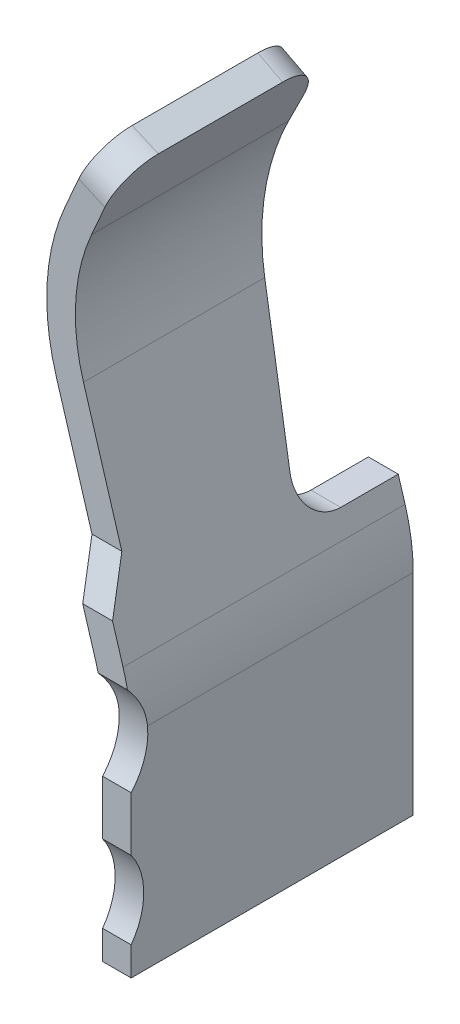
ISO-10303-21;
HEADER;
FILE_DESCRIPTION(('STEP AP214'),'2;1');
FILE_NAME('part.step','',(''),(''),'','','');
FILE_SCHEMA(('AUTOMOTIVE_DESIGN { 1 0 10303 214 1 1 1 1 }'));
ENDSEC;
DATA;
#1=APPLICATION_CONTEXT('core data for automotive mechanical design processes');
#2=APPLICATION_PROTOCOL_DEFINITION('international standard','automotive_design',2000,#1);
#3=PRODUCT_CONTEXT('',#1,'mechanical');
#4=PRODUCT('Part','Part','',(#3));
#5=PRODUCT_RELATED_PRODUCT_CATEGORY('part','',(#4));
#6=PRODUCT_DEFINITION_FORMATION('','',#4);
#7=PRODUCT_DEFINITION_CONTEXT('part definition',#1,'design');
#8=PRODUCT_DEFINITION('design','',#6,#7);
#9=PRODUCT_DEFINITION_SHAPE('','',#8);
#10=(LENGTH_UNIT() NAMED_UNIT(*) SI_UNIT(.MILLI.,.METRE.));
#11=(NAMED_UNIT(*) PLANE_ANGLE_UNIT() SI_UNIT($,.RADIAN.));
#12=(NAMED_UNIT(*) SI_UNIT($,.STERADIAN.) SOLID_ANGLE_UNIT());
#13=UNCERTAINTY_MEASURE_WITH_UNIT(LENGTH_MEASURE(1.E-05),#10,'distance_accuracy_value','');
#14=(GEOMETRIC_REPRESENTATION_CONTEXT(3) GLOBAL_UNCERTAINTY_ASSIGNED_CONTEXT((#13)) GLOBAL_UNIT_ASSIGNED_CONTEXT((#10,
#11,#12)) REPRESENTATION_CONTEXT('',''));
#15=CARTESIAN_POINT('',(0.,0.,0.));
#16=DIRECTION('',(0.,0.,1.));
#17=DIRECTION('',(1.,0.,0.));
#18=AXIS2_PLACEMENT_3D('',#15,#16,#17);
#19=CARTESIAN_POINT('',(-15.66,0.145965815192914,0.739999999999968));
#20=DIRECTION('',(0.,0.,-1.));
#21=DIRECTION('',(-1.,0.,0.));
#22=AXIS2_PLACEMENT_3D('',#19,#20,#21);
#23=PLANE('',#22);
#24=DIRECTION('',(0.,1.,0.));
#25=VECTOR('',#24,1.);
#26=CARTESIAN_POINT('',(-15.51,0.145965815192914,0.739999999999968));
#27=LINE('',#26,#25);
#28=CARTESIAN_POINT('',(-15.51,0.145965815192914,0.739999999999968));
#29=VERTEX_POINT('',#28);
#30=CARTESIAN_POINT('',(-15.51,0.296740599868535,0.739999999999968));
#31=VERTEX_POINT('',#30);
#32=EDGE_CURVE('E231',#29,#31,#27,.T.);
#33=ORIENTED_EDGE('',*,*,#32,.T.);
#34=DIRECTION('',(-1.,0.,0.));
#35=VECTOR('',#34,1.);
#36=CARTESIAN_POINT('',(-15.51,0.296740599868535,0.739999999999968));
#37=LINE('',#36,#35);
#38=CARTESIAN_POINT('',(-15.66,0.296740599868535,0.739999999999968));
#39=VERTEX_POINT('',#38);
#40=EDGE_CURVE('E211',#31,#39,#37,.T.);
#41=ORIENTED_EDGE('',*,*,#40,.T.);
#42=DIRECTION('',(0.,1.,0.));
#43=VECTOR('',#42,1.);
#44=CARTESIAN_POINT('',(-15.66,0.145965815192914,0.739999999999968));
#45=LINE('',#44,#43);
#46=CARTESIAN_POINT('',(-15.66,0.145965815192914,0.739999999999968));
#47=VERTEX_POINT('',#46);
#48=EDGE_CURVE('E248',#47,#39,#45,.T.);
#49=ORIENTED_EDGE('',*,*,#48,.F.);
#50=DIRECTION('',(-1.,0.,0.));
#51=VECTOR('',#50,1.);
#52=CARTESIAN_POINT('',(-15.66,0.145965815192914,0.739999999999968));
#53=LINE('',#52,#51);
#54=EDGE_CURVE('E237',#29,#47,#53,.T.);
#55=ORIENTED_EDGE('',*,*,#54,.F.);
#56=EDGE_LOOP('',(#33,#41,#49,#55));
#57=FACE_BOUND('',#56,.T.);
#58=ADVANCED_FACE('F55',(#57),#23,.F.);
#59=CARTESIAN_POINT('',(-15.51,0.145965815192914,-0.740000000000032));
#60=DIRECTION('',(-1.,0.,0.));
#61=DIRECTION('',(0.,0.,1.));
#62=AXIS2_PLACEMENT_3D('',#59,#60,#61);
#63=PLANE('',#62);
#64=DIRECTION('',(0.,-1.,0.));
#65=VECTOR('',#64,1.);
#66=CARTESIAN_POINT('',(-15.51,0.988055123608244,-0.740000000000032));
#67=LINE('',#66,#65);
#68=CARTESIAN_POINT('',(-15.51,1.24850586493128,-0.740000000000032));
#69=VERTEX_POINT('',#68);
#70=CARTESIAN_POINT('',(-15.51,0.145965815192914,-0.740000000000032));
#71=VERTEX_POINT('',#70);
#72=EDGE_CURVE('E261',#69,#71,#67,.T.);
#73=ORIENTED_EDGE('',*,*,#72,.F.);
#74=DIRECTION('',(0.,0.,1.));
#75=VECTOR('',#74,1.);
#76=CARTESIAN_POINT('',(-15.51,1.24850586493128,-0.740000000000032));
#77=LINE('',#76,#75);
#78=CARTESIAN_POINT('',(-15.51,1.24850586493128,0.654029100989329));
#79=VERTEX_POINT('',#78);
#80=EDGE_CURVE('E645',#69,#79,#77,.T.);
#81=ORIENTED_EDGE('',*,*,#80,.T.);
#82=CARTESIAN_POINT('',(-15.51,1.21669179396548,0.995153761033103));
#83=DIRECTION('',(1.,0.,0.));
#84=DIRECTION('',(0.,0.,1.));
#85=AXIS2_PLACEMENT_3D('',#82,#83,#84);
#86=CIRCLE('',#85,0.342604974863759);
#87=CARTESIAN_POINT('',(-15.51,0.988055123608244,0.739999999999968));
#88=VERTEX_POINT('',#87);
#89=EDGE_CURVE('E341',#88,#79,#86,.T.);
#90=ORIENTED_EDGE('',*,*,#89,.F.);
#91=CARTESIAN_POINT('',(-15.51,0.703259400131466,0.739999999999968));
#92=VERTEX_POINT('',#91);
#93=EDGE_CURVE('E234',#92,#88,#27,.T.);
#94=ORIENTED_EDGE('',*,*,#93,.F.);
#95=CARTESIAN_POINT('',(-15.51,0.5,1.01942683457021));
#96=DIRECTION('',(-1.,0.,0.));
#97=DIRECTION('',(0.,0.,1.));
#98=AXIS2_PLACEMENT_3D('',#95,#96,#97);
#99=CIRCLE('',#98,0.345533991988847);
#100=EDGE_CURVE('E214',#92,#31,#99,.T.);
#101=ORIENTED_EDGE('',*,*,#100,.T.);
#102=ORIENTED_EDGE('',*,*,#32,.F.);
#103=DIRECTION('',(0.,0.,1.));
#104=VECTOR('',#103,1.);
#105=CARTESIAN_POINT('',(-15.51,0.145965815192914,0.739999999999968));
#106=LINE('',#105,#104);
#107=EDGE_CURVE('E667',#71,#29,#106,.T.);
#108=ORIENTED_EDGE('',*,*,#107,.F.);
#109=EDGE_LOOP('',(#73,#81,#90,#94,#101,#102,#108));
#110=FACE_BOUND('',#109,.T.);
#111=ADVANCED_FACE('F229',(#110),#63,.F.);
#112=CARTESIAN_POINT('',(-15.552563357617,1.53714937485739,-0.740000000000032));
#113=DIRECTION('',(-0.957436642382955,-0.288643509926093,0.));
#114=DIRECTION('',(-0.288643509926093,0.957436642382955,0.));
#115=AXIS2_PLACEMENT_3D('',#112,#113,#114);
#116=PLANE('',#115);
#117=DIRECTION('',(0.286748539926822,-0.951150986717314,0.114398755747238));
#118=VECTOR('',#117,1.);
#119=CARTESIAN_POINT('',(-15.5703360451115,1.59610175610153,-0.205300934614503));
#120=LINE('',#119,#118);
#121=CARTESIAN_POINT('',(-15.6559916925664,1.88022335482148,-0.239473382341919));
#122=VERTEX_POINT('',#121);
#123=CARTESIAN_POINT('',(-15.8765862640963,2.61194022573823,-0.327479914176613));
#124=VERTEX_POINT('',#123);
#125=EDGE_CURVE('E556',#122,#124,#120,.F.);
#126=ORIENTED_EDGE('',*,*,#125,.T.);
#127=DIRECTION('',(0.,0.,1.));
#128=VECTOR('',#127,1.);
#129=CARTESIAN_POINT('',(-15.8765862640963,2.61194022573823,0.623604352914863));
#130=LINE('',#129,#128);
#131=CARTESIAN_POINT('',(-15.8765862640963,2.61194022573822,0.623604352914864));
#132=VERTEX_POINT('',#131);
#133=EDGE_CURVE('E733',#124,#132,#130,.T.);
#134=ORIENTED_EDGE('',*,*,#133,.T.);
#135=DIRECTION('',(-0.288643509926097,0.957436642382953,0.));
#136=VECTOR('',#135,1.);
#137=CARTESIAN_POINT('',(-15.6075789123208,1.71963713627576,0.623604352914864));
#138=LINE('',#137,#136);
#139=CARTESIAN_POINT('',(-15.6752588497716,1.94413292378286,0.623604352914864));
#140=VERTEX_POINT('',#139);
#141=EDGE_CURVE('E272',#140,#132,#138,.T.);
#142=ORIENTED_EDGE('',*,*,#141,.F.);
#143=DIRECTION('',(-0.258541028225375,0.857586072334426,-0.444637678635289));
#144=VECTOR('',#143,1.);
#145=CARTESIAN_POINT('',(-15.7335765616936,2.13757401070798,0.523309818502773));
#146=LINE('',#145,#144);
#147=CARTESIAN_POINT('',(-15.6075789123208,1.71963713627576,0.739999999999989));
#148=VERTEX_POINT('',#147);
#149=EDGE_CURVE('E677',#140,#148,#146,.F.);
#150=ORIENTED_EDGE('',*,*,#149,.T.);
#151=DIRECTION('',(0.288643509926092,-0.957436642382955,0.));
#152=VECTOR('',#151,1.);
#153=CARTESIAN_POINT('',(-15.552563357617,1.53714937485739,0.739999999999968));
#154=LINE('',#153,#152);
#155=CARTESIAN_POINT('',(-15.552563357617,1.53714937485737,0.739999999999968));
#156=VERTEX_POINT('',#155);
#157=EDGE_CURVE('E288',#148,#156,#154,.T.);
#158=ORIENTED_EDGE('',*,*,#157,.T.);
#159=DIRECTION('',(0.,0.,1.));
#160=VECTOR('',#159,1.);
#161=CARTESIAN_POINT('',(-15.552563357617,1.53714937485739,-0.740000000000032));
#162=LINE('',#161,#160);
#163=CARTESIAN_POINT('',(-15.5525633576171,1.53714937485737,-0.740000000000032));
#164=VERTEX_POINT('',#163);
#165=EDGE_CURVE('E614',#156,#164,#162,.F.);
#166=ORIENTED_EDGE('',*,*,#165,.T.);
#167=DIRECTION('',(0.28864350992616,-0.957436642382934,0.));
#168=VECTOR('',#167,1.);
#169=CARTESIAN_POINT('',(-15.51,1.39596581519291,-0.740000000000032));
#170=LINE('',#169,#168);
#171=CARTESIAN_POINT('',(-15.5884965908945,1.6563406715121,-0.740000000000032));
#172=VERTEX_POINT('',#171);
#173=EDGE_CURVE('E257',#172,#164,#170,.T.);
#174=ORIENTED_EDGE('',*,*,#173,.F.);
#175=DIRECTION('',(0.,0.,1.));
#176=VECTOR('',#175,1.);
#177=CARTESIAN_POINT('',(-15.5884965908945,1.6563406715121,-0.740000000000032));
#178=LINE('',#177,#176);
#179=CARTESIAN_POINT('',(-15.5884965908945,1.6563406715121,-0.438042305987952));
#180=VERTEX_POINT('',#179);
#181=EDGE_CURVE('E264',#172,#180,#178,.T.);
#182=ORIENTED_EDGE('',*,*,#181,.T.);
#183=CARTESIAN_POINT('',(-15.6487916531782,1.8563406715121,-0.438042305987952));
#184=DIRECTION('',(-0.957436642382955,-0.288643509926093,0.));
#185=DIRECTION('',(-0.288643509926092,0.957436642382955,0.));
#186=AXIS2_PLACEMENT_3D('',#183,#184,#185);
#187=ELLIPSE('',#186,0.208891106885383,0.2);
#188=EDGE_CURVE('E588',#180,#122,#187,.T.);
#189=ORIENTED_EDGE('',*,*,#188,.T.);
#190=EDGE_LOOP('',(#126,#134,#142,#150,#158,#166,#174,#182,#189));
#191=FACE_BOUND('',#190,.T.);
#192=ADVANCED_FACE('F749',(#191),#116,.F.);
#193=CARTESIAN_POINT('',(-15.6961788539745,1.49385284836847,-0.740000000000032));
#194=DIRECTION('',(0.957436642382956,0.28864350992609,0.));
#195=DIRECTION('',(0.,0.,-1.));
#196=AXIS2_PLACEMENT_3D('',#193,#194,#195);
#197=PLANE('',#196);
#198=DIRECTION('',(0.288643509926094,-0.957436642382954,0.));
#199=VECTOR('',#198,1.);
#200=CARTESIAN_POINT('',(-16.1427416852972,2.97511122810519,0.623604352914864));
#201=LINE('',#200,#199);
#202=CARTESIAN_POINT('',(-16.0202017604538,2.5686436992493,0.623604352914864));
#203=VERTEX_POINT('',#202);
#204=CARTESIAN_POINT('',(-15.8319271799357,1.94413292378286,0.623604352914864));
#205=VERTEX_POINT('',#204);
#206=EDGE_CURVE('E282',#203,#205,#201,.T.);
#207=ORIENTED_EDGE('',*,*,#206,.F.);
#208=DIRECTION('',(0.,0.,-1.));
#209=VECTOR('',#208,1.);
#210=CARTESIAN_POINT('',(-16.0202017604538,2.5686436992493,-0.740000000000032));
#211=LINE('',#210,#209);
#212=CARTESIAN_POINT('',(-16.0202017604538,2.5686436992493,-0.32227246674957));
#213=VERTEX_POINT('',#212);
#214=EDGE_CURVE('E658',#203,#213,#211,.T.);
#215=ORIENTED_EDGE('',*,*,#214,.T.);
#216=DIRECTION('',(-0.286748539926819,0.951150986717315,-0.114398755747238));
#217=VECTOR('',#216,1.);
#218=CARTESIAN_POINT('',(-15.7141223648881,1.55337185451572,-0.200161637444145));
#219=LINE('',#218,#217);
#220=CARTESIAN_POINT('',(-15.8126600227304,1.88022335482148,-0.239473382341919));
#221=VERTEX_POINT('',#220);
#222=EDGE_CURVE('E349',#213,#221,#219,.F.);
#223=ORIENTED_EDGE('',*,*,#222,.T.);
#224=CARTESIAN_POINT('',(-15.8054599833422,1.8563406715121,-0.438042305987952));
#225=DIRECTION('',(0.957436642382956,0.28864350992609,0.));
#226=DIRECTION('',(-0.288643509926089,0.957436642382956,0.));
#227=AXIS2_PLACEMENT_3D('',#224,#225,#226);
#228=ELLIPSE('',#227,0.208891106885383,0.2);
#229=CARTESIAN_POINT('',(-15.7451649210584,1.6563406715121,-0.438042305987952));
#230=VERTEX_POINT('',#229);
#231=EDGE_CURVE('E586',#221,#230,#228,.T.);
#232=ORIENTED_EDGE('',*,*,#231,.T.);
#233=DIRECTION('',(0.,0.,1.));
#234=VECTOR('',#233,1.);
#235=CARTESIAN_POINT('',(-15.7451649210584,1.6563406715121,-0.740000000000032));
#236=LINE('',#235,#234);
#237=CARTESIAN_POINT('',(-15.7451649210584,1.6563406715121,-0.740000000000032));
#238=VERTEX_POINT('',#237);
#239=EDGE_CURVE('E267',#238,#230,#236,.T.);
#240=ORIENTED_EDGE('',*,*,#239,.F.);
#241=DIRECTION('',(-0.288643509926002,0.957436642382982,0.));
#242=VECTOR('',#241,1.);
#243=CARTESIAN_POINT('',(-15.7451649210584,1.6563406715121,-0.740000000000032));
#244=LINE('',#243,#242);
#245=CARTESIAN_POINT('',(-15.6961788539745,1.49385284836843,-0.740000000000032));
#246=VERTEX_POINT('',#245);
#247=EDGE_CURVE('E245',#246,#238,#244,.T.);
#248=ORIENTED_EDGE('',*,*,#247,.F.);
#249=DIRECTION('',(0.,0.,-1.));
#250=VECTOR('',#249,1.);
#251=CARTESIAN_POINT('',(-15.6961788539745,1.49385284836843,0.690719095202405));
#252=LINE('',#251,#250);
#253=CARTESIAN_POINT('',(-15.6961788539745,1.49385284836843,0.739999999999968));
#254=VERTEX_POINT('',#253);
#255=EDGE_CURVE('E595',#246,#254,#252,.F.);
#256=ORIENTED_EDGE('',*,*,#255,.T.);
#257=DIRECTION('',(-0.288643509926089,0.957436642382956,0.));
#258=VECTOR('',#257,1.);
#259=CARTESIAN_POINT('',(-15.6961788539745,1.49385284836847,0.739999999999968));
#260=LINE('',#259,#258);
#261=CARTESIAN_POINT('',(-15.7642472424848,1.71963713627576,0.739999999999968));
#262=VERTEX_POINT('',#261);
#263=EDGE_CURVE('E293',#254,#262,#260,.T.);
#264=ORIENTED_EDGE('',*,*,#263,.T.);
#265=DIRECTION('',(-0.258541028225372,0.857586072334427,-0.44463767863529));
#266=VECTOR('',#265,1.);
#267=CARTESIAN_POINT('',(-15.7642472424848,1.71963713627576,0.739999999999989));
#268=LINE('',#267,#266);
#269=EDGE_CURVE('E689',#205,#262,#268,.F.);
#270=ORIENTED_EDGE('',*,*,#269,.F.);
#271=EDGE_LOOP('',(#207,#215,#223,#232,#240,#248,#256,#264,#270));
#272=FACE_BOUND('',#271,.T.);
#273=ADVANCED_FACE('F777',(#272),#197,.F.);
#274=CARTESIAN_POINT('',(-15.66,0.145965815192914,-0.740000000000032));
#275=DIRECTION('',(1.,0.,0.));
#276=DIRECTION('',(0.,0.,1.));
#277=AXIS2_PLACEMENT_3D('',#274,#275,#276);
#278=PLANE('',#277);
#279=CARTESIAN_POINT('',(-15.66,1.21669179396548,0.995153761033103));
#280=DIRECTION('',(1.,0.,0.));
#281=DIRECTION('',(0.,0.,-1.));
#282=AXIS2_PLACEMENT_3D('',#279,#280,#281);
#283=CIRCLE('',#282,0.342604974863759);
#284=CARTESIAN_POINT('',(-15.66,0.988055123608244,0.739999999999968));
#285=VERTEX_POINT('',#284);
#286=CARTESIAN_POINT('',(-15.66,1.24850586493125,0.654029100989326));
#287=VERTEX_POINT('',#286);
#288=EDGE_CURVE('E320',#285,#287,#283,.T.);
#289=ORIENTED_EDGE('',*,*,#288,.T.);
#290=DIRECTION('',(0.,0.,-1.));
#291=VECTOR('',#290,1.);
#292=CARTESIAN_POINT('',(-15.66,1.24850586493125,-0.740000000000032));
#293=LINE('',#292,#291);
#294=CARTESIAN_POINT('',(-15.66,1.24850586493125,-0.740000000000032));
#295=VERTEX_POINT('',#294);
#296=EDGE_CURVE('E591',#287,#295,#293,.T.);
#297=ORIENTED_EDGE('',*,*,#296,.T.);
#298=DIRECTION('',(0.,1.,0.));
#299=VECTOR('',#298,1.);
#300=CARTESIAN_POINT('',(-15.66,1.37384682265364,-0.740000000000032));
#301=LINE('',#300,#299);
#302=CARTESIAN_POINT('',(-15.66,0.145965815192914,-0.740000000000032));
#303=VERTEX_POINT('',#302);
#304=EDGE_CURVE('E239',#303,#295,#301,.T.);
#305=ORIENTED_EDGE('',*,*,#304,.F.);
#306=DIRECTION('',(0.,0.,-1.));
#307=VECTOR('',#306,1.);
#308=CARTESIAN_POINT('',(-15.66,0.145965815192914,-0.740000000000032));
#309=LINE('',#308,#307);
#310=EDGE_CURVE('E668',#47,#303,#309,.T.);
#311=ORIENTED_EDGE('',*,*,#310,.F.);
#312=ORIENTED_EDGE('',*,*,#48,.T.);
#313=CARTESIAN_POINT('',(-15.66,0.5,1.01942683457021));
#314=DIRECTION('',(-1.,0.,0.));
#315=DIRECTION('',(0.,0.,1.));
#316=AXIS2_PLACEMENT_3D('',#313,#314,#315);
#317=CIRCLE('',#316,0.345533991988847);
#318=CARTESIAN_POINT('',(-15.66,0.703259400131466,0.739999999999968));
#319=VERTEX_POINT('',#318);
#320=EDGE_CURVE('E217',#319,#39,#317,.T.);
#321=ORIENTED_EDGE('',*,*,#320,.F.);
#322=EDGE_CURVE('E692',#319,#285,#45,.T.);
#323=ORIENTED_EDGE('',*,*,#322,.T.);
#324=EDGE_LOOP('',(#289,#297,#305,#311,#312,#321,#323));
#325=FACE_BOUND('',#324,.T.);
#326=ADVANCED_FACE('F770',(#325),#278,.F.);
#327=CARTESIAN_POINT('',(-15.9576664899118,3.39577078475995,-0.421754368938228));
#328=DIRECTION('',(0.,-0.119413416546903,-0.992844618230162));
#329=DIRECTION('',(0.,0.992844618230162,-0.119413416546903));
#330=AXIS2_PLACEMENT_3D('',#327,#328,#329);
#331=PLANE('',#330);
#332=ORIENTED_EDGE('',*,*,#222,.F.);
#333=CARTESIAN_POINT('',(-14.9191496217134,2.9005837356643,-0.36219623035689));
#334=DIRECTION('',(0.,-0.119413416546903,-0.992844618230162));
#335=DIRECTION('',(0.,0.992844618230162,-0.119413416546903));
#336=AXIS2_PLACEMENT_3D('',#333,#334,#335);
#337=ELLIPSE('',#336,1.15828799278782,1.15);
#338=CARTESIAN_POINT('',(-15.9717757539039,3.36370167510265,-0.417897288102537));
#339=VERTEX_POINT('',#338);
#340=EDGE_CURVE('E78',#213,#339,#337,.T.);
#341=ORIENTED_EDGE('',*,*,#340,.T.);
#342=DIRECTION('',(-0.400292818236852,-0.909830186054405,0.109428936813832));
#343=VECTOR('',#342,1.);
#344=CARTESIAN_POINT('',(-15.9576664899118,3.39577078475995,-0.421754368938228));
#345=LINE('',#344,#343);
#346=CARTESIAN_POINT('',(-15.9103585226747,3.50329761180304,-0.434687053017791));
#347=VERTEX_POINT('',#346);
#348=EDGE_CURVE('E342',#347,#339,#345,.T.);
#349=ORIENTED_EDGE('',*,*,#348,.F.);
#350=DIRECTION('',(0.914255270392902,-0.402239697454464,0.0483789866630405));
#351=VECTOR('',#350,1.);
#352=CARTESIAN_POINT('',(-15.909786500442,3.50304594243096,-0.43465678372992));
#353=LINE('',#352,#351);
#354=CARTESIAN_POINT('',(-15.7730594619542,3.44289092405021,-0.427421697659662));
#355=VERTEX_POINT('',#354);
#356=EDGE_CURVE('E551',#347,#355,#353,.T.);
#357=ORIENTED_EDGE('',*,*,#356,.T.);
#358=DIRECTION('',(-0.400292818236852,-0.909830186054405,0.109428936813832));
#359=VECTOR('',#358,1.);
#360=CARTESIAN_POINT('',(-15.8200491803441,3.33608744850052,-0.414576013974327));
#361=LINE('',#360,#359);
#362=CARTESIAN_POINT('',(-15.8344766931834,3.30329498734982,-0.410631932744409));
#363=VERTEX_POINT('',#362);
#364=EDGE_CURVE('E549',#363,#355,#361,.F.);
#365=ORIENTED_EDGE('',*,*,#364,.F.);
#366=CARTESIAN_POINT('',(-14.9191496217134,2.90058373566432,-0.362196230356892));
#367=DIRECTION('',(0.,-0.119413416546903,-0.992844618230162));
#368=DIRECTION('',(0.,0.992844618230162,-0.119413416546903));
#369=AXIS2_PLACEMENT_3D('',#366,#367,#368);
#370=ELLIPSE('',#369,1.00720695025027,1.);
#371=EDGE_CURVE('E655',#363,#124,#370,.F.);
#372=ORIENTED_EDGE('',*,*,#371,.T.);
#373=ORIENTED_EDGE('',*,*,#125,.F.);
#374=DIRECTION('',(-1.,0.,0.));
#375=VECTOR('',#374,1.);
#376=CARTESIAN_POINT('',(-15.7451649210584,1.88022335482148,-0.239473382341919));
#377=LINE('',#376,#375);
#378=EDGE_CURVE('E555',#122,#221,#377,.T.);
#379=ORIENTED_EDGE('',*,*,#378,.T.);
#380=EDGE_LOOP('',(#332,#341,#349,#357,#365,#372,#373,#379));
#381=FACE_BOUND('',#380,.T.);
#382=ADVANCED_FACE('F807',(#381),#331,.T.);
#383=CARTESIAN_POINT('',(-15.8344766931834,3.30329498734984,-0.740000000000033));
#384=DIRECTION('',(-0.915327071470028,0.402711251685501,0.));
#385=DIRECTION('',(0.,0.,1.));
#386=AXIS2_PLACEMENT_3D('',#383,#384,#385);
#387=PLANE('',#386);
#388=DIRECTION('',(0.402711251685496,0.91532707147003,0.));
#389=VECTOR('',#388,1.);
#390=CARTESIAN_POINT('',(-15.9831427204819,2.96539025083029,0.623604352914864));
#391=LINE('',#390,#389);
#392=CARTESIAN_POINT('',(-15.8344766931834,3.30329498734982,0.623604352914864));
#393=VERTEX_POINT('',#392);
#394=CARTESIAN_POINT('',(-15.7642560060984,3.46290040089891,0.623604352914864));
#395=VERTEX_POINT('',#394);
#396=EDGE_CURVE('E276',#393,#395,#391,.T.);
#397=ORIENTED_EDGE('',*,*,#396,.F.);
#398=DIRECTION('',(0.,0.,1.));
#399=VECTOR('',#398,1.);
#400=CARTESIAN_POINT('',(-15.8344766931834,3.30329498734982,-0.369990770658941));
#401=LINE('',#400,#399);
#402=EDGE_CURVE('E732',#393,#363,#401,.F.);
#403=ORIENTED_EDGE('',*,*,#402,.T.);
#404=ORIENTED_EDGE('',*,*,#364,.T.);
#405=CARTESIAN_POINT('',(-15.7642560060984,3.46290040089891,-0.22838692789031));
#406=DIRECTION('',(-0.915327071470028,0.402711251685501,0.));
#407=DIRECTION('',(0.,-1.34945745301727E-13,-1.));
#408=AXIS2_PLACEMENT_3D('',#405,#406,#407);
#409=ELLIPSE('',#408,0.200234464292816,0.2);
#410=CARTESIAN_POINT('',(-15.6837137557613,3.64596581519291,-0.22838692789031));
#411=VERTEX_POINT('',#410);
#412=EDGE_CURVE('E579',#355,#411,#409,.F.);
#413=ORIENTED_EDGE('',*,*,#412,.T.);
#414=DIRECTION('',(0.,0.,1.));
#415=VECTOR('',#414,1.);
#416=CARTESIAN_POINT('',(-15.6837137557613,3.64596581519291,-0.740000000000032));
#417=LINE('',#416,#415);
#418=CARTESIAN_POINT('',(-15.6837137557613,3.64596581519291,0.423604352914864));
#419=VERTEX_POINT('',#418);
#420=EDGE_CURVE('E295',#411,#419,#417,.T.);
#421=ORIENTED_EDGE('',*,*,#420,.T.);
#422=CARTESIAN_POINT('',(-15.7642560060984,3.46290040089891,0.423604352914864));
#423=DIRECTION('',(-0.915327071470028,0.402711251685501,0.));
#424=DIRECTION('',(-0.402711251685501,-0.915327071470028,0.));
#425=AXIS2_PLACEMENT_3D('',#422,#423,#424);
#426=CIRCLE('',#425,0.2);
#427=EDGE_CURVE('E582',#419,#395,#426,.F.);
#428=ORIENTED_EDGE('',*,*,#427,.T.);
#429=EDGE_LOOP('',(#397,#403,#404,#413,#421,#428));
#430=FACE_BOUND('',#429,.T.);
#431=ADVANCED_FACE('F803',(#430),#387,.F.);
#432=CARTESIAN_POINT('',(-15.8210128164818,3.70637250294574,-0.740000000000033));
#433=DIRECTION('',(-0.402711251685494,-0.915327071470031,0.));
#434=DIRECTION('',(-0.91532707147003,0.402711251685494,0.));
#435=AXIS2_PLACEMENT_3D('',#432,#433,#434);
#436=PLANE('',#435);
#437=DIRECTION('',(0.,0.,1.));
#438=VECTOR('',#437,1.);
#439=CARTESIAN_POINT('',(-15.8210128164818,3.70637250294574,-0.740000000000033));
#440=LINE('',#439,#438);
#441=CARTESIAN_POINT('',(-15.8210128164818,3.70637250294574,-0.235652283248437));
#442=VERTEX_POINT('',#441);
#443=CARTESIAN_POINT('',(-15.8210128164818,3.70637250294574,0.423604352914864));
#444=VERTEX_POINT('',#443);
#445=EDGE_CURVE('E344',#442,#444,#440,.T.);
#446=ORIENTED_EDGE('',*,*,#445,.T.);
#447=DIRECTION('',(-0.915327071470031,0.402711251685494,0.));
#448=VECTOR('',#447,1.);
#449=CARTESIAN_POINT('',(-15.8210128164818,3.70637250294574,0.423604352914864));
#450=LINE('',#449,#448);
#451=EDGE_CURVE('E576',#444,#419,#450,.F.);
#452=ORIENTED_EDGE('',*,*,#451,.T.);
#453=ORIENTED_EDGE('',*,*,#420,.F.);
#454=DIRECTION('',(-0.914255270392902,0.402239697454464,-0.0483789866630405));
#455=VECTOR('',#454,1.);
#456=CARTESIAN_POINT('',(-15.8433204909929,3.71618708377106,-0.23683272236933));
#457=LINE('',#456,#455);
#458=EDGE_CURVE('E573',#411,#442,#457,.T.);
#459=ORIENTED_EDGE('',*,*,#458,.T.);
#460=EDGE_LOOP('',(#446,#452,#453,#459));
#461=FACE_BOUND('',#460,.T.);
#462=ADVANCED_FACE('F798',(#461),#436,.F.);
#463=CARTESIAN_POINT('',(-15.9717757539039,3.36370167510267,-0.740000000000033));
#464=DIRECTION('',(0.915327071470028,-0.402711251685501,0.));
#465=DIRECTION('',(0.,0.,-1.));
#466=AXIS2_PLACEMENT_3D('',#463,#464,#465);
#467=PLANE('',#466);
#468=ORIENTED_EDGE('',*,*,#348,.T.);
#469=DIRECTION('',(0.,0.,-1.));
#470=VECTOR('',#469,1.);
#471=CARTESIAN_POINT('',(-15.9717757539039,3.36370167510267,-0.740000000000033));
#472=LINE('',#471,#470);
#473=CARTESIAN_POINT('',(-15.9717757539039,3.36370167510263,0.623604352914864));
#474=VERTEX_POINT('',#473);
#475=EDGE_CURVE('E64',#339,#474,#472,.F.);
#476=ORIENTED_EDGE('',*,*,#475,.T.);
#477=DIRECTION('',(-0.402711251685497,-0.915327071470029,0.));
#478=VECTOR('',#477,1.);
#479=CARTESIAN_POINT('',(-15.8210128164818,3.70637250294574,0.623604352914864));
#480=LINE('',#479,#478);
#481=CARTESIAN_POINT('',(-15.9015550668189,3.52330708865174,0.623604352914864));
#482=VERTEX_POINT('',#481);
#483=EDGE_CURVE('E279',#482,#474,#480,.T.);
#484=ORIENTED_EDGE('',*,*,#483,.F.);
#485=CARTESIAN_POINT('',(-15.9015550668189,3.52330708865173,0.423604352914864));
#486=DIRECTION('',(0.915327071470028,-0.402711251685501,0.));
#487=DIRECTION('',(0.402711251685501,0.915327071470028,0.));
#488=AXIS2_PLACEMENT_3D('',#485,#486,#487);
#489=CIRCLE('',#488,0.2);
#490=EDGE_CURVE('E570',#482,#444,#489,.F.);
#491=ORIENTED_EDGE('',*,*,#490,.T.);
#492=ORIENTED_EDGE('',*,*,#445,.F.);
#493=CARTESIAN_POINT('',(-15.9015550668189,3.52330708865173,-0.235652283248437));
#494=DIRECTION('',(0.915327071470028,-0.402711251685501,0.));
#495=DIRECTION('',(0.,-1.44398149474617E-13,-1.));
#496=AXIS2_PLACEMENT_3D('',#493,#494,#495);
#497=ELLIPSE('',#496,0.200234464292816,0.2);
#498=EDGE_CURVE('E567',#442,#347,#497,.F.);
#499=ORIENTED_EDGE('',*,*,#498,.T.);
#500=EDGE_LOOP('',(#468,#476,#484,#491,#492,#499));
#501=FACE_BOUND('',#500,.T.);
#502=ADVANCED_FACE('F792',(#501),#467,.F.);
#503=CARTESIAN_POINT('',(-16.51,1.2485058649313,0.739999999999966));
#504=DIRECTION('',(0.,0.,-1.));
#505=DIRECTION('',(0.,-1.,0.));
#506=AXIS2_PLACEMENT_3D('',#503,#504,#505);
#507=PLANE('',#506);
#508=DIRECTION('',(1.,0.,0.));
#509=VECTOR('',#508,1.);
#510=CARTESIAN_POINT('',(-51.05,1.44532846432272,0.739999999999919));
#511=LINE('',#510,#509);
#512=CARTESIAN_POINT('',(-15.6831016601971,1.44532846432272,0.739999999999968));
#513=VERTEX_POINT('',#512);
#514=CARTESIAN_POINT('',(-15.5295608818653,1.44532846432272,0.739999999999968));
#515=VERTEX_POINT('',#514);
#516=EDGE_CURVE('E294',#513,#515,#511,.T.);
#517=ORIENTED_EDGE('',*,*,#516,.T.);
#518=CARTESIAN_POINT('',(-16.51,1.24850586493128,0.739999999999966));
#519=DIRECTION('',(0.,0.,-1.));
#520=DIRECTION('',(-1.,0.,0.));
#521=AXIS2_PLACEMENT_3D('',#518,#519,#520);
#522=CIRCLE('',#521,1.);
#523=EDGE_CURVE('E644',#515,#156,#522,.F.);
#524=ORIENTED_EDGE('',*,*,#523,.T.);
#525=ORIENTED_EDGE('',*,*,#157,.F.);
#526=DIRECTION('',(1.,0.,0.));
#527=VECTOR('',#526,1.);
#528=CARTESIAN_POINT('',(-15.7642472424848,1.71963713627576,0.739999999999989));
#529=LINE('',#528,#527);
#530=EDGE_CURVE('E271',#262,#148,#529,.T.);
#531=ORIENTED_EDGE('',*,*,#530,.F.);
#532=ORIENTED_EDGE('',*,*,#263,.F.);
#533=CARTESIAN_POINT('',(-16.51,1.24850586493125,0.739999999999966));
#534=DIRECTION('',(0.,0.,-1.));
#535=DIRECTION('',(-1.,0.,0.));
#536=AXIS2_PLACEMENT_3D('',#533,#534,#535);
#537=CIRCLE('',#536,0.85);
#538=EDGE_CURVE('E601',#254,#513,#537,.T.);
#539=ORIENTED_EDGE('',*,*,#538,.T.);
#540=EDGE_LOOP('',(#517,#524,#525,#531,#532,#539));
#541=FACE_BOUND('',#540,.T.);
#542=ADVANCED_FACE('F781',(#541),#507,.F.);
#543=CARTESIAN_POINT('',(-51.05,1.21669179396548,0.995153761033054));
#544=DIRECTION('',(1.,0.,0.));
#545=DIRECTION('',(0.,0.,-1.));
#546=AXIS2_PLACEMENT_3D('',#543,#544,#545);
#547=CYLINDRICAL_SURFACE('',#546,0.342604974863759);
#548=ORIENTED_EDGE('',*,*,#89,.T.);
#549=CARTESIAN_POINT('',(-15.51,1.24850586493128,0.654029100989329));
#550=CARTESIAN_POINT('',(-15.5099823555763,1.26744466427285,0.655776713741754));
#551=CARTESIAN_POINT('',(-15.5105378941727,1.28621620873536,0.659135716909905));
#552=CARTESIAN_POINT('',(-15.5125791431678,1.3224161038767,0.668751248563548));
#553=CARTESIAN_POINT('',(-15.5140397743369,1.33986688119649,0.674928507008774));
#554=CARTESIAN_POINT('',(-15.5176061617646,1.37266417060891,0.68960742646163));
#555=CARTESIAN_POINT('',(-15.5196773622937,1.38807160194692,0.697982449960442));
#556=CARTESIAN_POINT('',(-15.5243111150154,1.41777462838173,0.717186375811132));
#557=CARTESIAN_POINT('',(-15.5268850239536,1.43203099133629,0.728073321404988));
#558=CARTESIAN_POINT('',(-15.5295608818653,1.44532846432273,0.739999999999933));
#559=B_SPLINE_CURVE_WITH_KNOTS('',3,(#549,#550,#551,#552,#553,#554,#555,#556,#557,#558),
.UNSPECIFIED.,.F.,.F.,(4,2,2,2,4),(0.,0.0569567612671762,0.112401820984482,0.165169681520369,
0.219306994717504),.UNSPECIFIED.);
#560=EDGE_CURVE('E636',#79,#515,#559,.T.);
#561=ORIENTED_EDGE('',*,*,#560,.T.);
#562=ORIENTED_EDGE('',*,*,#516,.F.);
#563=CARTESIAN_POINT('',(-15.6831016601971,1.44532846432277,0.739999999999967));
#564=CARTESIAN_POINT('',(-15.6797375195606,1.43124134712007,0.727360841601942));
#565=CARTESIAN_POINT('',(-15.6765156908103,1.41606120909432,0.71588090337944));
#566=CARTESIAN_POINT('',(-15.670781215531,1.38437233841136,0.695818484397489));
#567=CARTESIAN_POINT('',(-15.6682515841679,1.3679112926389,0.687165350961427));
#568=CARTESIAN_POINT('',(-15.6642427151666,1.33483318982126,0.673095375697225));
#569=CARTESIAN_POINT('',(-15.6627050517419,1.31829852090912,0.667502284268865));
#570=CARTESIAN_POINT('',(-15.6605629349659,1.28407461312618,0.65876039152111));
#571=CARTESIAN_POINT('',(-15.6599840099926,1.26636646811984,0.655679531381397));
#572=CARTESIAN_POINT('',(-15.66,1.24850586493127,0.654029100989279));
#573=B_SPLINE_CURVE_WITH_KNOTS('',3,(#563,#564,#565,#566,#567,#568,#569,#570,#571,#572),
.UNSPECIFIED.,.F.,.F.,(4,2,2,2,4),(0.,0.0576264551528688,0.113676967245304,0.166018840488765,
0.219733245894203),.UNSPECIFIED.);
#574=EDGE_CURVE('E605',#513,#287,#573,.T.);
#575=ORIENTED_EDGE('',*,*,#574,.T.);
#576=ORIENTED_EDGE('',*,*,#288,.F.);
#577=DIRECTION('',(-1.,0.,0.));
#578=VECTOR('',#577,1.);
#579=CARTESIAN_POINT('',(-51.05,0.988055123608245,0.739999999999919));
#580=LINE('',#579,#578);
#581=EDGE_CURVE('E336',#88,#285,#580,.T.);
#582=ORIENTED_EDGE('',*,*,#581,.F.);
#583=EDGE_LOOP('',(#548,#561,#562,#575,#576,#582));
#584=FACE_BOUND('',#583,.T.);
#585=ADVANCED_FACE('F616',(#584),#547,.F.);
#586=CARTESIAN_POINT('',(-15.7642472424848,1.71963713627576,0.739999999999989));
#587=DIRECTION('',(0.,0.460287319631491,0.887770005906067));
#588=DIRECTION('',(0.,-0.887770005906067,0.460287319631491));
#589=AXIS2_PLACEMENT_3D('',#586,#587,#588);
#590=PLANE('',#589);
#591=ORIENTED_EDGE('',*,*,#530,.T.);
#592=ORIENTED_EDGE('',*,*,#149,.F.);
#593=DIRECTION('',(-1.,0.,0.));
#594=VECTOR('',#593,1.);
#595=CARTESIAN_POINT('',(-15.7642472424848,1.94413292378286,0.623604352914864));
#596=LINE('',#595,#594);
#597=EDGE_CURVE('E285',#205,#140,#596,.F.);
#598=ORIENTED_EDGE('',*,*,#597,.F.);
#599=ORIENTED_EDGE('',*,*,#269,.T.);
#600=EDGE_LOOP('',(#591,#592,#598,#599));
#601=FACE_BOUND('',#600,.T.);
#602=ADVANCED_FACE('F784',(#601),#590,.T.);
#603=CARTESIAN_POINT('',(0.,0.,0.623604352914864));
#604=DIRECTION('',(0.,0.,-1.));
#605=DIRECTION('',(-1.,0.,0.));
#606=AXIS2_PLACEMENT_3D('',#603,#604,#605);
#607=PLANE('',#606);
#608=ORIENTED_EDGE('',*,*,#483,.T.);
#609=CARTESIAN_POINT('',(-14.9191496217134,2.9005837356643,0.623604352914864));
#610=DIRECTION('',(0.,0.,-1.));
#611=DIRECTION('',(-1.,0.,0.));
#612=AXIS2_PLACEMENT_3D('',#609,#610,#611);
#613=CIRCLE('',#612,1.15);
#614=EDGE_CURVE('E12',#474,#203,#613,.F.);
#615=ORIENTED_EDGE('',*,*,#614,.T.);
#616=ORIENTED_EDGE('',*,*,#206,.T.);
#617=ORIENTED_EDGE('',*,*,#597,.T.);
#618=ORIENTED_EDGE('',*,*,#141,.T.);
#619=CARTESIAN_POINT('',(-14.9191496217134,2.90058373566432,0.623604352914864));
#620=DIRECTION('',(0.,0.,-1.));
#621=DIRECTION('',(-1.,0.,0.));
#622=AXIS2_PLACEMENT_3D('',#619,#620,#621);
#623=CIRCLE('',#622,1.);
#624=EDGE_CURVE('E652',#132,#393,#623,.T.);
#625=ORIENTED_EDGE('',*,*,#624,.T.);
#626=ORIENTED_EDGE('',*,*,#396,.T.);
#627=DIRECTION('',(-0.915327071470031,0.402711251685494,0.));
#628=VECTOR('',#627,1.);
#629=CARTESIAN_POINT('',(-1.28012112383579,-2.90960213925838,0.623604352914864));
#630=LINE('',#629,#628);
#631=EDGE_CURVE('E563',#395,#482,#630,.T.);
#632=ORIENTED_EDGE('',*,*,#631,.T.);
#633=EDGE_LOOP('',(#608,#615,#616,#617,#618,#625,#626,#632));
#634=FACE_BOUND('',#633,.T.);
#635=ADVANCED_FACE('F787',(#634),#607,.F.);
#636=CARTESIAN_POINT('',(-15.5884965908945,1.6563406715121,-0.740000000000032));
#637=DIRECTION('',(0.,-1.,0.));
#638=DIRECTION('',(0.,0.,-1.));
#639=AXIS2_PLACEMENT_3D('',#636,#637,#638);
#640=PLANE('',#639);
#641=ORIENTED_EDGE('',*,*,#239,.T.);
#642=DIRECTION('',(1.,0.,0.));
#643=VECTOR('',#642,1.);
#644=CARTESIAN_POINT('',(-15.5884965908945,1.6563406715121,-0.438042305987952));
#645=LINE('',#644,#643);
#646=EDGE_CURVE('E560',#230,#180,#645,.T.);
#647=ORIENTED_EDGE('',*,*,#646,.T.);
#648=ORIENTED_EDGE('',*,*,#181,.F.);
#649=DIRECTION('',(1.,0.,0.));
#650=VECTOR('',#649,1.);
#651=CARTESIAN_POINT('',(-15.5884965908945,1.6563406715121,-0.740000000000032));
#652=LINE('',#651,#650);
#653=EDGE_CURVE('E254',#238,#172,#652,.T.);
#654=ORIENTED_EDGE('',*,*,#653,.F.);
#655=EDGE_LOOP('',(#641,#647,#648,#654));
#656=FACE_BOUND('',#655,.T.);
#657=ADVANCED_FACE('F816',(#656),#640,.F.);
#658=CARTESIAN_POINT('',(0.,0.,-0.740000000000009));
#659=DIRECTION('',(0.,0.,1.));
#660=DIRECTION('',(1.,0.,0.));
#661=AXIS2_PLACEMENT_3D('',#658,#659,#660);
#662=PLANE('',#661);
#663=ORIENTED_EDGE('',*,*,#173,.T.);
#664=CARTESIAN_POINT('',(-16.51,1.24850586493128,-0.740000000000033));
#665=DIRECTION('',(0.,0.,1.));
#666=DIRECTION('',(1.,0.,0.));
#667=AXIS2_PLACEMENT_3D('',#664,#665,#666);
#668=CIRCLE('',#667,1.);
#669=EDGE_CURVE('E649',#164,#69,#668,.F.);
#670=ORIENTED_EDGE('',*,*,#669,.T.);
#671=ORIENTED_EDGE('',*,*,#72,.T.);
#672=DIRECTION('',(1.,0.,0.));
#673=VECTOR('',#672,1.);
#674=CARTESIAN_POINT('',(-15.51,0.145965815192914,-0.740000000000032));
#675=LINE('',#674,#673);
#676=EDGE_CURVE('E665',#303,#71,#675,.T.);
#677=ORIENTED_EDGE('',*,*,#676,.F.);
#678=ORIENTED_EDGE('',*,*,#304,.T.);
#679=CARTESIAN_POINT('',(-16.51,1.24850586493125,-0.740000000000033));
#680=DIRECTION('',(0.,0.,1.));
#681=DIRECTION('',(1.,0.,0.));
#682=AXIS2_PLACEMENT_3D('',#679,#680,#681);
#683=CIRCLE('',#682,0.85);
#684=EDGE_CURVE('E598',#295,#246,#683,.T.);
#685=ORIENTED_EDGE('',*,*,#684,.T.);
#686=ORIENTED_EDGE('',*,*,#247,.T.);
#687=ORIENTED_EDGE('',*,*,#653,.T.);
#688=EDGE_LOOP('',(#663,#670,#671,#677,#678,#685,#686,#687));
#689=FACE_BOUND('',#688,.T.);
#690=ADVANCED_FACE('F754',(#689),#662,.F.);
#691=ORIENTED_EDGE('',*,*,#322,.F.);
#692=DIRECTION('',(-1.,0.,0.));
#693=VECTOR('',#692,1.);
#694=CARTESIAN_POINT('',(-15.51,0.703259400131466,0.739999999999968));
#695=LINE('',#694,#693);
#696=EDGE_CURVE('E223',#92,#319,#695,.T.);
#697=ORIENTED_EDGE('',*,*,#696,.F.);
#698=ORIENTED_EDGE('',*,*,#93,.T.);
#699=ORIENTED_EDGE('',*,*,#581,.T.);
#700=EDGE_LOOP('',(#691,#697,#698,#699));
#701=FACE_BOUND('',#700,.T.);
#702=ADVANCED_FACE('F763',(#701),#23,.F.);
#703=CARTESIAN_POINT('',(0.,0.145965815192914,0.));
#704=DIRECTION('',(0.,1.,0.));
#705=DIRECTION('',(0.,0.,1.));
#706=AXIS2_PLACEMENT_3D('',#703,#704,#705);
#707=PLANE('',#706);
#708=ORIENTED_EDGE('',*,*,#310,.T.);
#709=ORIENTED_EDGE('',*,*,#676,.T.);
#710=ORIENTED_EDGE('',*,*,#107,.T.);
#711=ORIENTED_EDGE('',*,*,#54,.T.);
#712=EDGE_LOOP('',(#708,#709,#710,#711));
#713=FACE_BOUND('',#712,.T.);
#714=ADVANCED_FACE('F767',(#713),#707,.F.);
#715=CARTESIAN_POINT('',(-15.51,0.5,1.01942683457021));
#716=DIRECTION('',(-1.,0.,0.));
#717=DIRECTION('',(0.,0.,1.));
#718=AXIS2_PLACEMENT_3D('',#715,#716,#717);
#719=CYLINDRICAL_SURFACE('',#718,0.345533991988847);
#720=ORIENTED_EDGE('',*,*,#320,.T.);
#721=ORIENTED_EDGE('',*,*,#40,.F.);
#722=ORIENTED_EDGE('',*,*,#100,.F.);
#723=ORIENTED_EDGE('',*,*,#696,.T.);
#724=EDGE_LOOP('',(#720,#721,#722,#723));
#725=FACE_BOUND('',#724,.T.);
#726=ADVANCED_FACE('F213',(#725),#719,.F.);
#727=CARTESIAN_POINT('',(-15.9576664899118,1.8563406715121,-0.438042305987951));
#728=DIRECTION('',(-1.,0.,0.));
#729=DIRECTION('',(0.,0.,1.));
#730=AXIS2_PLACEMENT_3D('',#727,#728,#729);
#731=CYLINDRICAL_SURFACE('',#730,0.2);
#732=ORIENTED_EDGE('',*,*,#188,.F.);
#733=ORIENTED_EDGE('',*,*,#646,.F.);
#734=ORIENTED_EDGE('',*,*,#231,.F.);
#735=ORIENTED_EDGE('',*,*,#378,.F.);
#736=EDGE_LOOP('',(#732,#733,#734,#735));
#737=FACE_BOUND('',#736,.T.);
#738=ADVANCED_FACE('F814',(#737),#731,.F.);
#739=CARTESIAN_POINT('',(-1.28012112383579,-2.90960213925838,0.423604352914864));
#740=DIRECTION('',(-0.915327071470031,0.402711251685494,0.));
#741=DIRECTION('',(-0.402711251685494,-0.915327071470031,0.));
#742=AXIS2_PLACEMENT_3D('',#739,#740,#741);
#743=CYLINDRICAL_SURFACE('',#742,0.2);
#744=ORIENTED_EDGE('',*,*,#427,.F.);
#745=ORIENTED_EDGE('',*,*,#451,.F.);
#746=ORIENTED_EDGE('',*,*,#490,.F.);
#747=ORIENTED_EDGE('',*,*,#631,.F.);
#748=EDGE_LOOP('',(#744,#745,#746,#747));
#749=FACE_BOUND('',#748,.T.);
#750=ADVANCED_FACE('F802',(#749),#743,.T.);
#751=CARTESIAN_POINT('',(-15.909786500442,3.52692862574034,-0.236087860083887));
#752=DIRECTION('',(-0.914255270392902,0.402239697454464,-0.0483789866630405));
#753=DIRECTION('',(-0.402711251685494,-0.915327071470031,0.));
#754=AXIS2_PLACEMENT_3D('',#751,#752,#753);
#755=CYLINDRICAL_SURFACE('',#754,0.2);
#756=ORIENTED_EDGE('',*,*,#498,.F.);
#757=ORIENTED_EDGE('',*,*,#458,.F.);
#758=ORIENTED_EDGE('',*,*,#412,.F.);
#759=ORIENTED_EDGE('',*,*,#356,.F.);
#760=EDGE_LOOP('',(#756,#757,#758,#759));
#761=FACE_BOUND('',#760,.T.);
#762=ADVANCED_FACE('F626',(#761),#755,.T.);
#763=CARTESIAN_POINT('',(-16.51,1.24850586493125,-0.740000000000033));
#764=DIRECTION('',(0.,0.,1.));
#765=DIRECTION('',(1.,0.,0.));
#766=AXIS2_PLACEMENT_3D('',#763,#764,#765);
#767=CYLINDRICAL_SURFACE('',#766,0.85);
#768=ORIENTED_EDGE('',*,*,#538,.F.);
#769=ORIENTED_EDGE('',*,*,#255,.F.);
#770=ORIENTED_EDGE('',*,*,#684,.F.);
#771=ORIENTED_EDGE('',*,*,#296,.F.);
#772=ORIENTED_EDGE('',*,*,#574,.F.);
#773=EDGE_LOOP('',(#768,#769,#770,#771,#772));
#774=FACE_BOUND('',#773,.T.);
#775=ADVANCED_FACE('F620',(#774),#767,.F.);
#776=CARTESIAN_POINT('',(-14.9191496217134,2.90058373566432,-0.740000000000031));
#777=DIRECTION('',(0.,0.,-1.));
#778=DIRECTION('',(-1.,0.,0.));
#779=AXIS2_PLACEMENT_3D('',#776,#777,#778);
#780=CYLINDRICAL_SURFACE('',#779,1.);
#781=ORIENTED_EDGE('',*,*,#371,.F.);
#782=ORIENTED_EDGE('',*,*,#402,.F.);
#783=ORIENTED_EDGE('',*,*,#624,.F.);
#784=ORIENTED_EDGE('',*,*,#133,.F.);
#785=EDGE_LOOP('',(#781,#782,#783,#784));
#786=FACE_BOUND('',#785,.T.);
#787=ADVANCED_FACE('F625',(#786),#780,.F.);
#788=CARTESIAN_POINT('',(-16.51,1.24850586493128,-0.740000000000033));
#789=DIRECTION('',(0.,0.,1.));
#790=DIRECTION('',(1.,0.,0.));
#791=AXIS2_PLACEMENT_3D('',#788,#789,#790);
#792=CYLINDRICAL_SURFACE('',#791,1.);
#793=ORIENTED_EDGE('',*,*,#669,.F.);
#794=ORIENTED_EDGE('',*,*,#165,.F.);
#795=ORIENTED_EDGE('',*,*,#523,.F.);
#796=ORIENTED_EDGE('',*,*,#560,.F.);
#797=ORIENTED_EDGE('',*,*,#80,.F.);
#798=EDGE_LOOP('',(#793,#794,#795,#796,#797));
#799=FACE_BOUND('',#798,.T.);
#800=ADVANCED_FACE('F630',(#799),#792,.T.);
#801=CARTESIAN_POINT('',(-14.9191496217134,2.9005837356643,-0.740000000000031));
#802=DIRECTION('',(0.,0.,-1.));
#803=DIRECTION('',(-1.,0.,0.));
#804=AXIS2_PLACEMENT_3D('',#801,#802,#803);
#805=CYLINDRICAL_SURFACE('',#804,1.15);
#806=ORIENTED_EDGE('',*,*,#614,.F.);
#807=ORIENTED_EDGE('',*,*,#475,.F.);
#808=ORIENTED_EDGE('',*,*,#340,.F.);
#809=ORIENTED_EDGE('',*,*,#214,.F.);
#810=EDGE_LOOP('',(#806,#807,#808,#809));
#811=FACE_BOUND('',#810,.T.);
#812=ADVANCED_FACE('F57',(#811),#805,.T.);
#813=CLOSED_SHELL('',(#58,#111,#192,#273,#326,#382,#431,#462,#502,#542,#585,#602,#635,#657,#690,
#702,#714,#726,#738,#750,#762,#775,#787,#800,#812));
#814=MANIFOLD_SOLID_BREP('B2',#813);
#815=ADVANCED_BREP_SHAPE_REPRESENTATION('',(#18,#814),#14);
#816=SHAPE_DEFINITION_REPRESENTATION(#9,#815);
ENDSEC;
END-ISO-10303-21;
